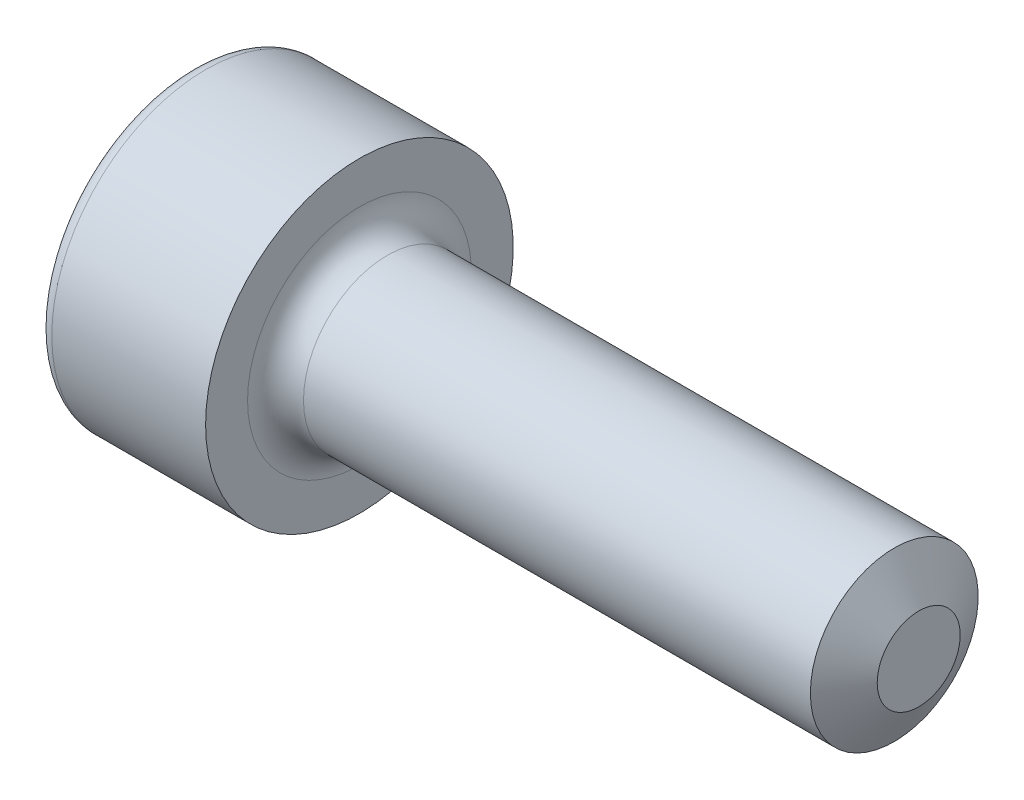
ISO-10303-21;
HEADER;
FILE_DESCRIPTION(('STEP AP214'),'2;1');
FILE_NAME('part.step','',(''),(''),'','','');
FILE_SCHEMA(('AUTOMOTIVE_DESIGN { 1 0 10303 214 1 1 1 1 }'));
ENDSEC;
DATA;
#1=APPLICATION_CONTEXT('core data for automotive mechanical design processes');
#2=APPLICATION_PROTOCOL_DEFINITION('international standard','automotive_design',2000,#1);
#3=PRODUCT_CONTEXT('',#1,'mechanical');
#4=PRODUCT('Part','Part','',(#3));
#5=PRODUCT_RELATED_PRODUCT_CATEGORY('part','',(#4));
#6=PRODUCT_DEFINITION_FORMATION('','',#4);
#7=PRODUCT_DEFINITION_CONTEXT('part definition',#1,'design');
#8=PRODUCT_DEFINITION('design','',#6,#7);
#9=PRODUCT_DEFINITION_SHAPE('','',#8);
#10=(LENGTH_UNIT() NAMED_UNIT(*) SI_UNIT(.MILLI.,.METRE.));
#11=(NAMED_UNIT(*) PLANE_ANGLE_UNIT() SI_UNIT($,.RADIAN.));
#12=(NAMED_UNIT(*) SI_UNIT($,.STERADIAN.) SOLID_ANGLE_UNIT());
#13=UNCERTAINTY_MEASURE_WITH_UNIT(LENGTH_MEASURE(1.E-05),#10,'distance_accuracy_value','');
#14=(GEOMETRIC_REPRESENTATION_CONTEXT(3) GLOBAL_UNCERTAINTY_ASSIGNED_CONTEXT((#13)) GLOBAL_UNIT_ASSIGNED_CONTEXT((#10,
#11,#12)) REPRESENTATION_CONTEXT('',''));
#15=CARTESIAN_POINT('',(0.,0.,0.));
#16=DIRECTION('',(0.,0.,1.));
#17=DIRECTION('',(1.,0.,0.));
#18=AXIS2_PLACEMENT_3D('',#15,#16,#17);
#19=CARTESIAN_POINT('',(0.,0.,0.));
#20=DIRECTION('',(-1.,0.,0.));
#21=DIRECTION('',(0.,0.,1.));
#22=AXIS2_PLACEMENT_3D('',#19,#20,#21);
#23=CYLINDRICAL_SURFACE('',#22,0.6);
#24=CARTESIAN_POINT('',(1.4,0.,0.));
#25=DIRECTION('',(-1.,0.,0.));
#26=DIRECTION('',(0.,0.,1.));
#27=AXIS2_PLACEMENT_3D('',#24,#25,#26);
#28=CIRCLE('',#27,0.6);
#29=CARTESIAN_POINT('',(1.4,0.,0.6));
#30=VERTEX_POINT('',#29);
#31=EDGE_CURVE('E117',#30,#30,#28,.T.);
#32=ORIENTED_EDGE('',*,*,#31,.F.);
#33=EDGE_LOOP('',(#32));
#34=FACE_BOUND('',#33,.T.);
#35=CARTESIAN_POINT('',(5.02500513340862,0.,0.));
#36=DIRECTION('',(-1.,0.,0.));
#37=DIRECTION('',(0.,0.,1.));
#38=AXIS2_PLACEMENT_3D('',#35,#36,#37);
#39=CIRCLE('',#38,0.6);
#40=CARTESIAN_POINT('',(5.02500513340862,0.,0.6));
#41=VERTEX_POINT('',#40);
#42=EDGE_CURVE('E299',#41,#41,#39,.T.);
#43=ORIENTED_EDGE('',*,*,#42,.T.);
#44=EDGE_LOOP('',(#43));
#45=FACE_BOUND('',#44,.T.);
#46=ADVANCED_FACE('F41',(#34,#45),#23,.T.);
#47=CARTESIAN_POINT('',(0.,0.,0.));
#48=DIRECTION('',(1.,0.,0.));
#49=DIRECTION('',(0.,0.,-1.));
#50=AXIS2_PLACEMENT_3D('',#47,#48,#49);
#51=PLANE('',#50);
#52=CARTESIAN_POINT('',(0.,0.,0.));
#53=DIRECTION('',(1.,0.,0.));
#54=DIRECTION('',(0.,0.,-1.));
#55=AXIS2_PLACEMENT_3D('',#52,#53,#54);
#56=CIRCLE('',#55,1.);
#57=CARTESIAN_POINT('',(0.,0.,-1.));
#58=VERTEX_POINT('',#57);
#59=EDGE_CURVE('E49',#58,#58,#56,.F.);
#60=ORIENTED_EDGE('',*,*,#59,.T.);
#61=EDGE_LOOP('',(#60));
#62=FACE_BOUND('',#61,.T.);
#63=DIRECTION('',(0.,0.866025403784439,-0.5));
#64=VECTOR('',#63,1.);
#65=CARTESIAN_POINT('',(0.,0.,0.675));
#66=LINE('',#65,#64);
#67=CARTESIAN_POINT('',(0.,0.,0.675));
#68=VERTEX_POINT('',#67);
#69=CARTESIAN_POINT('',(0.,0.584567147554496,0.3375));
#70=VERTEX_POINT('',#69);
#71=EDGE_CURVE('E332',#68,#70,#66,.T.);
#72=ORIENTED_EDGE('',*,*,#71,.F.);
#73=DIRECTION('',(0.,0.866025403784439,0.5));
#74=VECTOR('',#73,1.);
#75=CARTESIAN_POINT('',(0.,-0.584567147554496,0.3375));
#76=LINE('',#75,#74);
#77=CARTESIAN_POINT('',(0.,-0.584567147554496,0.3375));
#78=VERTEX_POINT('',#77);
#79=EDGE_CURVE('E56',#78,#68,#76,.T.);
#80=ORIENTED_EDGE('',*,*,#79,.F.);
#81=DIRECTION('',(0.,0.,1.));
#82=VECTOR('',#81,1.);
#83=CARTESIAN_POINT('',(0.,-0.584567147554496,-0.3375));
#84=LINE('',#83,#82);
#85=CARTESIAN_POINT('',(0.,-0.584567147554496,-0.3375));
#86=VERTEX_POINT('',#85);
#87=EDGE_CURVE('E92',#86,#78,#84,.T.);
#88=ORIENTED_EDGE('',*,*,#87,.F.);
#89=DIRECTION('',(0.,-0.866025403784439,0.5));
#90=VECTOR('',#89,1.);
#91=CARTESIAN_POINT('',(0.,0.,-0.675));
#92=LINE('',#91,#90);
#93=CARTESIAN_POINT('',(0.,0.,-0.675));
#94=VERTEX_POINT('',#93);
#95=EDGE_CURVE('E100',#94,#86,#92,.T.);
#96=ORIENTED_EDGE('',*,*,#95,.F.);
#97=DIRECTION('',(0.,-0.866025403784439,-0.5));
#98=VECTOR('',#97,1.);
#99=CARTESIAN_POINT('',(0.,0.584567147554496,-0.3375));
#100=LINE('',#99,#98);
#101=CARTESIAN_POINT('',(0.,0.584567147554496,-0.3375));
#102=VERTEX_POINT('',#101);
#103=EDGE_CURVE('E106',#102,#94,#100,.T.);
#104=ORIENTED_EDGE('',*,*,#103,.F.);
#105=DIRECTION('',(0.,0.,-1.));
#106=VECTOR('',#105,1.);
#107=CARTESIAN_POINT('',(0.,0.584567147554496,0.3375));
#108=LINE('',#107,#106);
#109=EDGE_CURVE('E335',#70,#102,#108,.T.);
#110=ORIENTED_EDGE('',*,*,#109,.F.);
#111=EDGE_LOOP('',(#72,#80,#88,#96,#104,#110));
#112=FACE_BOUND('',#111,.T.);
#113=ADVANCED_FACE('F109',(#62,#112),#51,.F.);
#114=CARTESIAN_POINT('',(0.,0.,0.));
#115=DIRECTION('',(-1.,0.,0.));
#116=DIRECTION('',(0.,0.,1.));
#117=AXIS2_PLACEMENT_3D('',#114,#115,#116);
#118=CYLINDRICAL_SURFACE('',#117,1.1);
#119=CARTESIAN_POINT('',(0.1,0.,0.));
#120=DIRECTION('',(1.,0.,0.));
#121=DIRECTION('',(0.,0.,-1.));
#122=AXIS2_PLACEMENT_3D('',#119,#120,#121);
#123=CIRCLE('',#122,1.1);
#124=CARTESIAN_POINT('',(0.1,0.,-1.1));
#125=VERTEX_POINT('',#124);
#126=EDGE_CURVE('E11',#125,#125,#123,.T.);
#127=ORIENTED_EDGE('',*,*,#126,.T.);
#128=EDGE_LOOP('',(#127));
#129=FACE_BOUND('',#128,.T.);
#130=CARTESIAN_POINT('',(1.2,0.,0.));
#131=DIRECTION('',(-1.,0.,0.));
#132=DIRECTION('',(0.,0.,1.));
#133=AXIS2_PLACEMENT_3D('',#130,#131,#132);
#134=CIRCLE('',#133,1.1);
#135=CARTESIAN_POINT('',(1.2,0.,1.1));
#136=VERTEX_POINT('',#135);
#137=EDGE_CURVE('E131',#136,#136,#134,.T.);
#138=ORIENTED_EDGE('',*,*,#137,.T.);
#139=EDGE_LOOP('',(#138));
#140=FACE_BOUND('',#139,.T.);
#141=ADVANCED_FACE('F154',(#129,#140),#118,.T.);
#142=CARTESIAN_POINT('',(1.2,1.1,0.));
#143=DIRECTION('',(-1.,0.,0.));
#144=DIRECTION('',(0.,0.,1.));
#145=AXIS2_PLACEMENT_3D('',#142,#143,#144);
#146=PLANE('',#145);
#147=ORIENTED_EDGE('',*,*,#137,.F.);
#148=EDGE_LOOP('',(#147));
#149=FACE_BOUND('',#148,.T.);
#150=CARTESIAN_POINT('',(1.2,0.,0.));
#151=DIRECTION('',(-1.,0.,0.));
#152=DIRECTION('',(0.,0.,1.));
#153=AXIS2_PLACEMENT_3D('',#150,#151,#152);
#154=CIRCLE('',#153,0.8);
#155=CARTESIAN_POINT('',(1.2,0.,0.8));
#156=VERTEX_POINT('',#155);
#157=EDGE_CURVE('E128',#156,#156,#154,.T.);
#158=ORIENTED_EDGE('',*,*,#157,.T.);
#159=EDGE_LOOP('',(#158));
#160=FACE_BOUND('',#159,.T.);
#161=ADVANCED_FACE('F163',(#149,#160),#146,.F.);
#162=CARTESIAN_POINT('',(1.4,0.,0.));
#163=DIRECTION('',(-1.,0.,0.));
#164=DIRECTION('',(0.,0.,1.));
#165=AXIS2_PLACEMENT_3D('',#162,#163,#164);
#166=TOROIDAL_SURFACE('',#165,0.8,0.2);
#167=ORIENTED_EDGE('',*,*,#157,.F.);
#168=EDGE_LOOP('',(#167));
#169=FACE_BOUND('',#168,.T.);
#170=ORIENTED_EDGE('',*,*,#31,.T.);
#171=EDGE_LOOP('',(#170));
#172=FACE_BOUND('',#171,.T.);
#173=ADVANCED_FACE('F159',(#169,#172),#166,.F.);
#174=CARTESIAN_POINT('',(0.7,-0.584567147554496,0.3375));
#175=DIRECTION('',(0.,-0.5,0.866025403784439));
#176=DIRECTION('',(0.,-0.866025403784439,-0.5));
#177=AXIS2_PLACEMENT_3D('',#174,#175,#176);
#178=PLANE('',#177);
#179=ORIENTED_EDGE('',*,*,#79,.T.);
#180=DIRECTION('',(-1.,0.,0.));
#181=VECTOR('',#180,1.);
#182=CARTESIAN_POINT('',(0.7,0.,0.675));
#183=LINE('',#182,#181);
#184=CARTESIAN_POINT('',(0.7,0.,0.675));
#185=VERTEX_POINT('',#184);
#186=EDGE_CURVE('E124',#185,#68,#183,.T.);
#187=ORIENTED_EDGE('',*,*,#186,.F.);
#188=DIRECTION('',(0.,0.866025403784439,0.5));
#189=VECTOR('',#188,1.);
#190=CARTESIAN_POINT('',(0.7,-0.584567147554496,0.3375));
#191=LINE('',#190,#189);
#192=CARTESIAN_POINT('',(0.7,-0.584567147554496,0.3375));
#193=VERTEX_POINT('',#192);
#194=EDGE_CURVE('E110',#193,#185,#191,.T.);
#195=ORIENTED_EDGE('',*,*,#194,.F.);
#196=DIRECTION('',(-1.,0.,0.));
#197=VECTOR('',#196,1.);
#198=CARTESIAN_POINT('',(0.7,-0.584567147554496,0.3375));
#199=LINE('',#198,#197);
#200=EDGE_CURVE('E96',#193,#78,#199,.T.);
#201=ORIENTED_EDGE('',*,*,#200,.T.);
#202=EDGE_LOOP('',(#179,#187,#195,#201));
#203=FACE_BOUND('',#202,.T.);
#204=ADVANCED_FACE('F162',(#203),#178,.F.);
#205=CARTESIAN_POINT('',(0.7,-0.584567147554496,-0.3375));
#206=DIRECTION('',(0.,-1.,0.));
#207=DIRECTION('',(0.,0.,-1.));
#208=AXIS2_PLACEMENT_3D('',#205,#206,#207);
#209=PLANE('',#208);
#210=ORIENTED_EDGE('',*,*,#87,.T.);
#211=ORIENTED_EDGE('',*,*,#200,.F.);
#212=DIRECTION('',(0.,0.,1.));
#213=VECTOR('',#212,1.);
#214=CARTESIAN_POINT('',(0.7,-0.584567147554496,-0.3375));
#215=LINE('',#214,#213);
#216=CARTESIAN_POINT('',(0.7,-0.584567147554496,-0.3375));
#217=VERTEX_POINT('',#216);
#218=EDGE_CURVE('E93',#217,#193,#215,.T.);
#219=ORIENTED_EDGE('',*,*,#218,.F.);
#220=DIRECTION('',(-1.,0.,0.));
#221=VECTOR('',#220,1.);
#222=CARTESIAN_POINT('',(0.7,-0.584567147554496,-0.3375));
#223=LINE('',#222,#221);
#224=EDGE_CURVE('E87',#217,#86,#223,.T.);
#225=ORIENTED_EDGE('',*,*,#224,.T.);
#226=EDGE_LOOP('',(#210,#211,#219,#225));
#227=FACE_BOUND('',#226,.T.);
#228=ADVANCED_FACE('F89',(#227),#209,.F.);
#229=CARTESIAN_POINT('',(0.7,0.,-0.675));
#230=DIRECTION('',(0.,-0.5,-0.866025403784439));
#231=DIRECTION('',(0.,0.866025403784439,-0.5));
#232=AXIS2_PLACEMENT_3D('',#229,#230,#231);
#233=PLANE('',#232);
#234=ORIENTED_EDGE('',*,*,#95,.T.);
#235=ORIENTED_EDGE('',*,*,#224,.F.);
#236=DIRECTION('',(0.,-0.866025403784439,0.5));
#237=VECTOR('',#236,1.);
#238=CARTESIAN_POINT('',(0.7,0.,-0.675));
#239=LINE('',#238,#237);
#240=CARTESIAN_POINT('',(0.7,0.,-0.675));
#241=VERTEX_POINT('',#240);
#242=EDGE_CURVE('E328',#241,#217,#239,.T.);
#243=ORIENTED_EDGE('',*,*,#242,.F.);
#244=DIRECTION('',(-1.,0.,0.));
#245=VECTOR('',#244,1.);
#246=CARTESIAN_POINT('',(0.7,0.,-0.675));
#247=LINE('',#246,#245);
#248=EDGE_CURVE('E97',#241,#94,#247,.T.);
#249=ORIENTED_EDGE('',*,*,#248,.T.);
#250=EDGE_LOOP('',(#234,#235,#243,#249));
#251=FACE_BOUND('',#250,.T.);
#252=ADVANCED_FACE('F101',(#251),#233,.F.);
#253=CARTESIAN_POINT('',(0.7,0.584567147554496,-0.3375));
#254=DIRECTION('',(0.,0.5,-0.866025403784439));
#255=DIRECTION('',(0.,0.866025403784439,0.5));
#256=AXIS2_PLACEMENT_3D('',#253,#254,#255);
#257=PLANE('',#256);
#258=ORIENTED_EDGE('',*,*,#103,.T.);
#259=ORIENTED_EDGE('',*,*,#248,.F.);
#260=DIRECTION('',(0.,-0.866025403784439,-0.5));
#261=VECTOR('',#260,1.);
#262=CARTESIAN_POINT('',(0.7,0.584567147554496,-0.3375));
#263=LINE('',#262,#261);
#264=CARTESIAN_POINT('',(0.7,0.584567147554496,-0.3375));
#265=VERTEX_POINT('',#264);
#266=EDGE_CURVE('E325',#265,#241,#263,.T.);
#267=ORIENTED_EDGE('',*,*,#266,.F.);
#268=DIRECTION('',(-1.,0.,0.));
#269=VECTOR('',#268,1.);
#270=CARTESIAN_POINT('',(0.7,0.584567147554496,-0.3375));
#271=LINE('',#270,#269);
#272=EDGE_CURVE('E120',#265,#102,#271,.T.);
#273=ORIENTED_EDGE('',*,*,#272,.T.);
#274=EDGE_LOOP('',(#258,#259,#267,#273));
#275=FACE_BOUND('',#274,.T.);
#276=ADVANCED_FACE('F204',(#275),#257,.F.);
#277=CARTESIAN_POINT('',(0.7,0.584567147554496,0.3375));
#278=DIRECTION('',(0.,1.,0.));
#279=DIRECTION('',(0.,0.,1.));
#280=AXIS2_PLACEMENT_3D('',#277,#278,#279);
#281=PLANE('',#280);
#282=ORIENTED_EDGE('',*,*,#109,.T.);
#283=ORIENTED_EDGE('',*,*,#272,.F.);
#284=DIRECTION('',(0.,0.,-1.));
#285=VECTOR('',#284,1.);
#286=CARTESIAN_POINT('',(0.7,0.584567147554496,0.3375));
#287=LINE('',#286,#285);
#288=CARTESIAN_POINT('',(0.7,0.584567147554496,0.3375));
#289=VERTEX_POINT('',#288);
#290=EDGE_CURVE('E322',#289,#265,#287,.T.);
#291=ORIENTED_EDGE('',*,*,#290,.F.);
#292=DIRECTION('',(-1.,0.,0.));
#293=VECTOR('',#292,1.);
#294=CARTESIAN_POINT('',(0.7,0.584567147554496,0.3375));
#295=LINE('',#294,#293);
#296=EDGE_CURVE('E122',#289,#70,#295,.T.);
#297=ORIENTED_EDGE('',*,*,#296,.T.);
#298=EDGE_LOOP('',(#282,#283,#291,#297));
#299=FACE_BOUND('',#298,.T.);
#300=ADVANCED_FACE('F211',(#299),#281,.F.);
#301=CARTESIAN_POINT('',(0.7,0.,0.675));
#302=DIRECTION('',(0.,0.5,0.866025403784439));
#303=DIRECTION('',(0.,-0.866025403784439,0.5));
#304=AXIS2_PLACEMENT_3D('',#301,#302,#303);
#305=PLANE('',#304);
#306=ORIENTED_EDGE('',*,*,#71,.T.);
#307=ORIENTED_EDGE('',*,*,#296,.F.);
#308=DIRECTION('',(0.,0.866025403784439,-0.5));
#309=VECTOR('',#308,1.);
#310=CARTESIAN_POINT('',(0.7,0.,0.675));
#311=LINE('',#310,#309);
#312=EDGE_CURVE('E113',#185,#289,#311,.T.);
#313=ORIENTED_EDGE('',*,*,#312,.F.);
#314=ORIENTED_EDGE('',*,*,#186,.T.);
#315=EDGE_LOOP('',(#306,#307,#313,#314));
#316=FACE_BOUND('',#315,.T.);
#317=ADVANCED_FACE('F219',(#316),#305,.F.);
#318=CARTESIAN_POINT('',(0.7,-0.584567147554496,-0.3375));
#319=DIRECTION('',(-0.846989116360023,0.265805115059731,0.460387964195145));
#320=DIRECTION('',(0.477567606733334,0.,0.878595003968834));
#321=AXIS2_PLACEMENT_3D('',#318,#319,#320);
#322=PLANE('',#321);
#323=DIRECTION('',(-0.477567606733334,-0.7608855930751,-0.439297501984417));
#324=VECTOR('',#323,1.);
#325=CARTESIAN_POINT('',(1.06690185249043,0.,0.));
#326=LINE('',#325,#324);
#327=CARTESIAN_POINT('',(1.06690185249043,0.,0.));
#328=VERTEX_POINT('',#327);
#329=EDGE_CURVE('E65',#328,#217,#326,.T.);
#330=ORIENTED_EDGE('',*,*,#329,.F.);
#331=DIRECTION('',(-0.477567606733334,0.,-0.878595003968834));
#332=VECTOR('',#331,1.);
#333=CARTESIAN_POINT('',(1.06690185249043,0.,0.));
#334=LINE('',#333,#332);
#335=EDGE_CURVE('E308',#328,#241,#334,.T.);
#336=ORIENTED_EDGE('',*,*,#335,.T.);
#337=ORIENTED_EDGE('',*,*,#242,.T.);
#338=EDGE_LOOP('',(#330,#336,#337));
#339=FACE_BOUND('',#338,.T.);
#340=ADVANCED_FACE('F227',(#339),#322,.T.);
#341=CARTESIAN_POINT('',(0.7,0.,-0.675));
#342=DIRECTION('',(-0.846989116360023,-0.265805115059731,0.460387964195145));
#343=DIRECTION('',(0.477567606733334,0.,0.878595003968834));
#344=AXIS2_PLACEMENT_3D('',#341,#342,#343);
#345=PLANE('',#344);
#346=ORIENTED_EDGE('',*,*,#335,.F.);
#347=DIRECTION('',(-0.477567606733334,0.7608855930751,-0.439297501984417));
#348=VECTOR('',#347,1.);
#349=CARTESIAN_POINT('',(1.06690185249043,0.,0.));
#350=LINE('',#349,#348);
#351=EDGE_CURVE('E312',#328,#265,#350,.T.);
#352=ORIENTED_EDGE('',*,*,#351,.T.);
#353=ORIENTED_EDGE('',*,*,#266,.T.);
#354=EDGE_LOOP('',(#346,#352,#353));
#355=FACE_BOUND('',#354,.T.);
#356=ADVANCED_FACE('F235',(#355),#345,.T.);
#357=CARTESIAN_POINT('',(0.7,-0.584567147554496,0.3375));
#358=DIRECTION('',(-0.846989116360023,0.531610230119462,0.));
#359=DIRECTION('',(-0.531610230119462,-0.846989116360023,0.));
#360=AXIS2_PLACEMENT_3D('',#357,#358,#359);
#361=PLANE('',#360);
#362=DIRECTION('',(-0.477567606733334,-0.7608855930751,0.439297501984417));
#363=VECTOR('',#362,1.);
#364=CARTESIAN_POINT('',(1.06690185249043,0.,0.));
#365=LINE('',#364,#363);
#366=EDGE_CURVE('E315',#328,#193,#365,.T.);
#367=ORIENTED_EDGE('',*,*,#366,.F.);
#368=ORIENTED_EDGE('',*,*,#329,.T.);
#369=ORIENTED_EDGE('',*,*,#218,.T.);
#370=EDGE_LOOP('',(#367,#368,#369));
#371=FACE_BOUND('',#370,.T.);
#372=ADVANCED_FACE('F243',(#371),#361,.T.);
#373=CARTESIAN_POINT('',(0.7,0.584567147554496,-0.3375));
#374=DIRECTION('',(-0.846989116360023,-0.531610230119462,0.));
#375=DIRECTION('',(0.531610230119462,-0.846989116360023,0.));
#376=AXIS2_PLACEMENT_3D('',#373,#374,#375);
#377=PLANE('',#376);
#378=ORIENTED_EDGE('',*,*,#351,.F.);
#379=DIRECTION('',(-0.477567606733334,0.7608855930751,0.439297501984417));
#380=VECTOR('',#379,1.);
#381=CARTESIAN_POINT('',(1.06690185249043,0.,0.));
#382=LINE('',#381,#380);
#383=EDGE_CURVE('E303',#328,#289,#382,.T.);
#384=ORIENTED_EDGE('',*,*,#383,.T.);
#385=ORIENTED_EDGE('',*,*,#290,.T.);
#386=EDGE_LOOP('',(#378,#384,#385));
#387=FACE_BOUND('',#386,.T.);
#388=ADVANCED_FACE('F251',(#387),#377,.T.);
#389=CARTESIAN_POINT('',(0.7,0.,0.675));
#390=DIRECTION('',(-0.846989116360023,0.265805115059731,-0.460387964195146));
#391=DIRECTION('',(-0.477567606733334,0.,0.878595003968834));
#392=AXIS2_PLACEMENT_3D('',#389,#390,#391);
#393=PLANE('',#392);
#394=DIRECTION('',(-0.477567606733334,0.,0.878595003968834));
#395=VECTOR('',#394,1.);
#396=CARTESIAN_POINT('',(1.06690185249043,0.,0.));
#397=LINE('',#396,#395);
#398=EDGE_CURVE('E298',#328,#185,#397,.T.);
#399=ORIENTED_EDGE('',*,*,#398,.F.);
#400=ORIENTED_EDGE('',*,*,#366,.T.);
#401=ORIENTED_EDGE('',*,*,#194,.T.);
#402=EDGE_LOOP('',(#399,#400,#401));
#403=FACE_BOUND('',#402,.T.);
#404=ADVANCED_FACE('F258',(#403),#393,.T.);
#405=CARTESIAN_POINT('',(0.7,0.584567147554496,0.3375));
#406=DIRECTION('',(-0.846989116360023,-0.265805115059731,-0.460387964195146));
#407=DIRECTION('',(-0.477567606733334,0.,0.878595003968834));
#408=AXIS2_PLACEMENT_3D('',#405,#406,#407);
#409=PLANE('',#408);
#410=ORIENTED_EDGE('',*,*,#383,.F.);
#411=ORIENTED_EDGE('',*,*,#398,.T.);
#412=ORIENTED_EDGE('',*,*,#312,.T.);
#413=EDGE_LOOP('',(#410,#411,#412));
#414=FACE_BOUND('',#413,.T.);
#415=ADVANCED_FACE('F266',(#414),#409,.T.);
#416=CARTESIAN_POINT('',(5.02500513340862,0.,0.));
#417=DIRECTION('',(-1.,0.,0.));
#418=DIRECTION('',(0.,0.,1.));
#419=AXIS2_PLACEMENT_3D('',#416,#417,#418);
#420=CONICAL_SURFACE('',#419,0.6,1.0471975511966);
#421=CARTESIAN_POINT('',(5.2,0.,0.));
#422=DIRECTION('',(-1.,0.,0.));
#423=DIRECTION('',(0.,0.,1.));
#424=AXIS2_PLACEMENT_3D('',#421,#422,#423);
#425=CIRCLE('',#424,0.2969);
#426=CARTESIAN_POINT('',(5.2,0.,0.2969));
#427=VERTEX_POINT('',#426);
#428=EDGE_CURVE('E295',#427,#427,#425,.T.);
#429=ORIENTED_EDGE('',*,*,#428,.T.);
#430=EDGE_LOOP('',(#429));
#431=FACE_BOUND('',#430,.T.);
#432=ORIENTED_EDGE('',*,*,#42,.F.);
#433=EDGE_LOOP('',(#432));
#434=FACE_BOUND('',#433,.T.);
#435=ADVANCED_FACE('F144',(#431,#434),#420,.T.);
#436=CARTESIAN_POINT('',(5.2,0.6,0.));
#437=DIRECTION('',(-1.,0.,0.));
#438=DIRECTION('',(0.,0.,1.));
#439=AXIS2_PLACEMENT_3D('',#436,#437,#438);
#440=PLANE('',#439);
#441=ORIENTED_EDGE('',*,*,#428,.F.);
#442=EDGE_LOOP('',(#441));
#443=FACE_BOUND('',#442,.T.);
#444=ADVANCED_FACE('F139',(#443),#440,.F.);
#445=CARTESIAN_POINT('',(0.1,0.,0.));
#446=DIRECTION('',(1.,0.,0.));
#447=DIRECTION('',(0.,0.,-1.));
#448=AXIS2_PLACEMENT_3D('',#445,#446,#447);
#449=TOROIDAL_SURFACE('',#448,1.,0.1);
#450=ORIENTED_EDGE('',*,*,#126,.F.);
#451=EDGE_LOOP('',(#450));
#452=FACE_BOUND('',#451,.T.);
#453=ORIENTED_EDGE('',*,*,#59,.F.);
#454=EDGE_LOOP('',(#453));
#455=FACE_BOUND('',#454,.T.);
#456=ADVANCED_FACE('F43',(#452,#455),#449,.T.);
#457=CLOSED_SHELL('',(#46,#113,#141,#161,#173,#204,#228,#252,#276,#300,#317,#340,#356,#372,#388,
#404,#415,#435,#444,#456));
#458=MANIFOLD_SOLID_BREP('B2',#457);
#459=ADVANCED_BREP_SHAPE_REPRESENTATION('',(#18,#458),#14);
#460=SHAPE_DEFINITION_REPRESENTATION(#9,#459);
ENDSEC;
END-ISO-10303-21;
